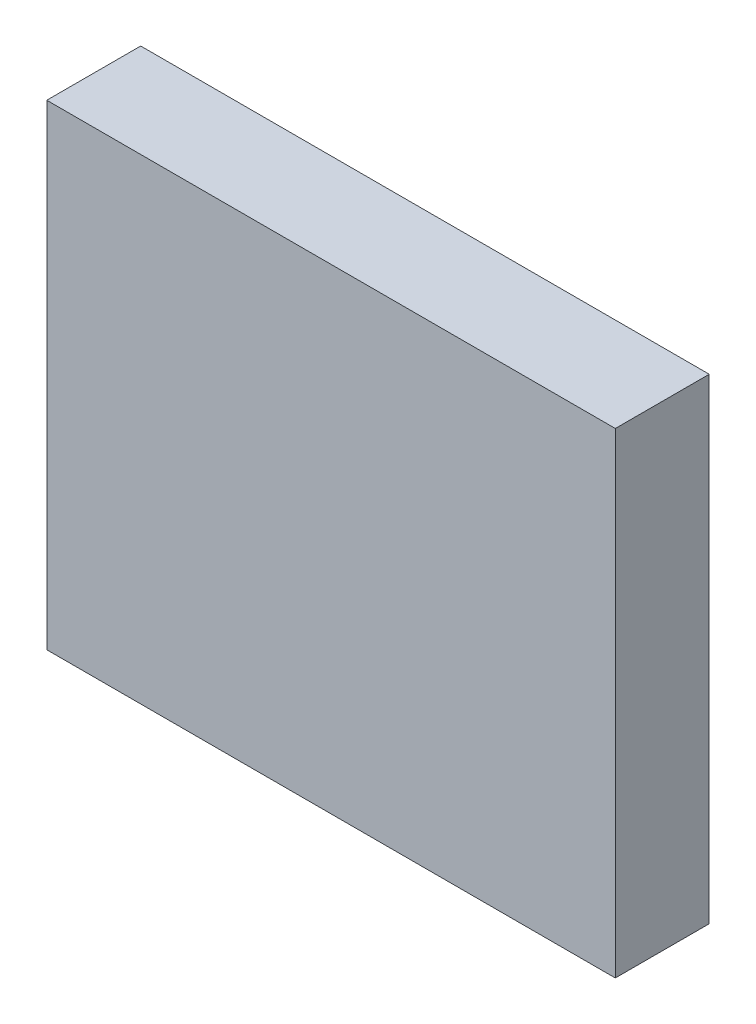
ISO-10303-21;
HEADER;
FILE_DESCRIPTION(('STEP AP214'),'2;1');
FILE_NAME('part.step','',(''),(''),'','','');
FILE_SCHEMA(('AUTOMOTIVE_DESIGN { 1 0 10303 214 1 1 1 1 }'));
ENDSEC;
DATA;
#1=APPLICATION_CONTEXT('core data for automotive mechanical design processes');
#2=APPLICATION_PROTOCOL_DEFINITION('international standard','automotive_design',2000,#1);
#3=PRODUCT_CONTEXT('',#1,'mechanical');
#4=PRODUCT('Part','Part','',(#3));
#5=PRODUCT_RELATED_PRODUCT_CATEGORY('part','',(#4));
#6=PRODUCT_DEFINITION_FORMATION('','',#4);
#7=PRODUCT_DEFINITION_CONTEXT('part definition',#1,'design');
#8=PRODUCT_DEFINITION('design','',#6,#7);
#9=PRODUCT_DEFINITION_SHAPE('','',#8);
#10=(LENGTH_UNIT() NAMED_UNIT(*) SI_UNIT(.MILLI.,.METRE.));
#11=(NAMED_UNIT(*) PLANE_ANGLE_UNIT() SI_UNIT($,.RADIAN.));
#12=(NAMED_UNIT(*) SI_UNIT($,.STERADIAN.) SOLID_ANGLE_UNIT());
#13=UNCERTAINTY_MEASURE_WITH_UNIT(LENGTH_MEASURE(1.E-05),#10,'distance_accuracy_value','');
#14=(GEOMETRIC_REPRESENTATION_CONTEXT(3) GLOBAL_UNCERTAINTY_ASSIGNED_CONTEXT((#13)) GLOBAL_UNIT_ASSIGNED_CONTEXT((#10,
#11,#12)) REPRESENTATION_CONTEXT('',''));
#15=CARTESIAN_POINT('',(0.,0.,0.));
#16=DIRECTION('',(0.,0.,1.));
#17=DIRECTION('',(1.,0.,0.));
#18=AXIS2_PLACEMENT_3D('',#15,#16,#17);
#19=CARTESIAN_POINT('',(5.3862802180531,6.07197695380085,1.7018));
#20=DIRECTION('',(-1.,0.,0.));
#21=DIRECTION('',(0.,0.,1.));
#22=AXIS2_PLACEMENT_3D('',#19,#20,#21);
#23=PLANE('',#22);
#24=DIRECTION('',(0.,1.,0.));
#25=VECTOR('',#24,1.);
#26=CARTESIAN_POINT('',(5.3862802180531,1.00539551473042,1.7018));
#27=LINE('',#26,#25);
#28=CARTESIAN_POINT('',(5.3862802180531,1.00539551473042,1.7018));
#29=VERTEX_POINT('',#28);
#30=CARTESIAN_POINT('',(5.3862802180531,6.07197695380085,1.7018));
#31=VERTEX_POINT('',#30);
#32=EDGE_CURVE('E85',#29,#31,#27,.T.);
#33=ORIENTED_EDGE('',*,*,#32,.F.);
#34=DIRECTION('',(0.,0.,1.));
#35=VECTOR('',#34,1.);
#36=CARTESIAN_POINT('',(5.3862802180531,1.00539551473042,1.7018));
#37=LINE('',#36,#35);
#38=CARTESIAN_POINT('',(5.3862802180531,1.00539551473042,2.7018));
#39=VERTEX_POINT('',#38);
#40=EDGE_CURVE('E73',#29,#39,#37,.T.);
#41=ORIENTED_EDGE('',*,*,#40,.T.);
#42=DIRECTION('',(0.,-1.,0.));
#43=VECTOR('',#42,1.);
#44=CARTESIAN_POINT('',(5.3862802180531,1.00539551473042,2.7018));
#45=LINE('',#44,#43);
#46=CARTESIAN_POINT('',(5.3862802180531,6.07197695380085,2.7018));
#47=VERTEX_POINT('',#46);
#48=EDGE_CURVE('E104',#47,#39,#45,.T.);
#49=ORIENTED_EDGE('',*,*,#48,.F.);
#50=DIRECTION('',(0.,0.,1.));
#51=VECTOR('',#50,1.);
#52=CARTESIAN_POINT('',(5.3862802180531,6.07197695380085,1.7018));
#53=LINE('',#52,#51);
#54=EDGE_CURVE('E11',#31,#47,#53,.T.);
#55=ORIENTED_EDGE('',*,*,#54,.F.);
#56=EDGE_LOOP('',(#33,#41,#49,#55));
#57=FACE_BOUND('',#56,.T.);
#58=ADVANCED_FACE('F16',(#57),#23,.T.);
#59=CARTESIAN_POINT('',(11.4391046090036,6.07197695380085,1.7018));
#60=DIRECTION('',(0.,1.,0.));
#61=DIRECTION('',(1.,0.,0.));
#62=AXIS2_PLACEMENT_3D('',#59,#60,#61);
#63=PLANE('',#62);
#64=DIRECTION('',(1.,0.,0.));
#65=VECTOR('',#64,1.);
#66=CARTESIAN_POINT('',(5.3862802180531,6.07197695380085,1.7018));
#67=LINE('',#66,#65);
#68=CARTESIAN_POINT('',(11.4391046090036,6.07197695380085,1.7018));
#69=VERTEX_POINT('',#68);
#70=EDGE_CURVE('E89',#31,#69,#67,.T.);
#71=ORIENTED_EDGE('',*,*,#70,.F.);
#72=ORIENTED_EDGE('',*,*,#54,.T.);
#73=DIRECTION('',(-1.,0.,0.));
#74=VECTOR('',#73,1.);
#75=CARTESIAN_POINT('',(5.3862802180531,6.07197695380085,2.7018));
#76=LINE('',#75,#74);
#77=CARTESIAN_POINT('',(11.4391046090036,6.07197695380085,2.7018));
#78=VERTEX_POINT('',#77);
#79=EDGE_CURVE('E100',#78,#47,#76,.T.);
#80=ORIENTED_EDGE('',*,*,#79,.F.);
#81=DIRECTION('',(0.,0.,1.));
#82=VECTOR('',#81,1.);
#83=CARTESIAN_POINT('',(11.4391046090036,6.07197695380085,1.7018));
#84=LINE('',#83,#82);
#85=EDGE_CURVE('E27',#69,#78,#84,.T.);
#86=ORIENTED_EDGE('',*,*,#85,.F.);
#87=EDGE_LOOP('',(#71,#72,#80,#86));
#88=FACE_BOUND('',#87,.T.);
#89=ADVANCED_FACE('F18',(#88),#63,.T.);
#90=CARTESIAN_POINT('',(11.4391046090036,1.00539551473042,1.7018));
#91=DIRECTION('',(1.,0.,0.));
#92=DIRECTION('',(0.,1.,0.));
#93=AXIS2_PLACEMENT_3D('',#90,#91,#92);
#94=PLANE('',#93);
#95=DIRECTION('',(0.,-1.,0.));
#96=VECTOR('',#95,1.);
#97=CARTESIAN_POINT('',(11.4391046090036,6.07197695380085,1.7018));
#98=LINE('',#97,#96);
#99=CARTESIAN_POINT('',(11.4391046090036,1.00539551473042,1.7018));
#100=VERTEX_POINT('',#99);
#101=EDGE_CURVE('E93',#69,#100,#98,.T.);
#102=ORIENTED_EDGE('',*,*,#101,.F.);
#103=ORIENTED_EDGE('',*,*,#85,.T.);
#104=DIRECTION('',(0.,1.,0.));
#105=VECTOR('',#104,1.);
#106=CARTESIAN_POINT('',(11.4391046090036,6.07197695380085,2.7018));
#107=LINE('',#106,#105);
#108=CARTESIAN_POINT('',(11.4391046090036,1.00539551473042,2.7018));
#109=VERTEX_POINT('',#108);
#110=EDGE_CURVE('E20',#109,#78,#107,.T.);
#111=ORIENTED_EDGE('',*,*,#110,.F.);
#112=DIRECTION('',(0.,0.,1.));
#113=VECTOR('',#112,1.);
#114=CARTESIAN_POINT('',(11.4391046090036,1.00539551473042,1.7018));
#115=LINE('',#114,#113);
#116=EDGE_CURVE('E82',#100,#109,#115,.T.);
#117=ORIENTED_EDGE('',*,*,#116,.F.);
#118=EDGE_LOOP('',(#102,#103,#111,#117));
#119=FACE_BOUND('',#118,.T.);
#120=ADVANCED_FACE('F175',(#119),#94,.T.);
#121=CARTESIAN_POINT('',(5.3862802180531,1.00539551473042,1.7018));
#122=DIRECTION('',(0.,-1.,0.));
#123=DIRECTION('',(0.,0.,-1.));
#124=AXIS2_PLACEMENT_3D('',#121,#122,#123);
#125=PLANE('',#124);
#126=DIRECTION('',(-1.,0.,0.));
#127=VECTOR('',#126,1.);
#128=CARTESIAN_POINT('',(11.4391046090036,1.00539551473042,1.7018));
#129=LINE('',#128,#127);
#130=EDGE_CURVE('E77',#100,#29,#129,.T.);
#131=ORIENTED_EDGE('',*,*,#130,.F.);
#132=ORIENTED_EDGE('',*,*,#116,.T.);
#133=DIRECTION('',(1.,0.,0.));
#134=VECTOR('',#133,1.);
#135=CARTESIAN_POINT('',(11.4391046090036,1.00539551473042,2.7018));
#136=LINE('',#135,#134);
#137=EDGE_CURVE('E79',#39,#109,#136,.T.);
#138=ORIENTED_EDGE('',*,*,#137,.F.);
#139=ORIENTED_EDGE('',*,*,#40,.F.);
#140=EDGE_LOOP('',(#131,#132,#138,#139));
#141=FACE_BOUND('',#140,.T.);
#142=ADVANCED_FACE('F74',(#141),#125,.T.);
#143=CARTESIAN_POINT('',(8.41269241352836,3.53868623426563,2.7018));
#144=DIRECTION('',(0.,0.,1.));
#145=DIRECTION('',(1.,0.,0.));
#146=AXIS2_PLACEMENT_3D('',#143,#144,#145);
#147=PLANE('',#146);
#148=ORIENTED_EDGE('',*,*,#137,.T.);
#149=ORIENTED_EDGE('',*,*,#110,.T.);
#150=ORIENTED_EDGE('',*,*,#79,.T.);
#151=ORIENTED_EDGE('',*,*,#48,.T.);
#152=EDGE_LOOP('',(#148,#149,#150,#151));
#153=FACE_BOUND('',#152,.T.);
#154=ADVANCED_FACE('F174',(#153),#147,.T.);
#155=CARTESIAN_POINT('',(8.41269241352836,3.53868623426563,1.7018));
#156=DIRECTION('',(0.,0.,1.));
#157=DIRECTION('',(1.,0.,0.));
#158=AXIS2_PLACEMENT_3D('',#155,#156,#157);
#159=PLANE('',#158);
#160=ORIENTED_EDGE('',*,*,#130,.T.);
#161=ORIENTED_EDGE('',*,*,#32,.T.);
#162=ORIENTED_EDGE('',*,*,#70,.T.);
#163=ORIENTED_EDGE('',*,*,#101,.T.);
#164=EDGE_LOOP('',(#160,#161,#162,#163));
#165=FACE_BOUND('',#164,.T.);
#166=ADVANCED_FACE('F92',(#165),#159,.F.);
#167=CLOSED_SHELL('',(#58,#89,#120,#142,#154,#166));
#168=MANIFOLD_SOLID_BREP('B1',#167);
#169=ADVANCED_BREP_SHAPE_REPRESENTATION('',(#18,#168),#14);
#170=SHAPE_DEFINITION_REPRESENTATION(#9,#169);
ENDSEC;
END-ISO-10303-21;
